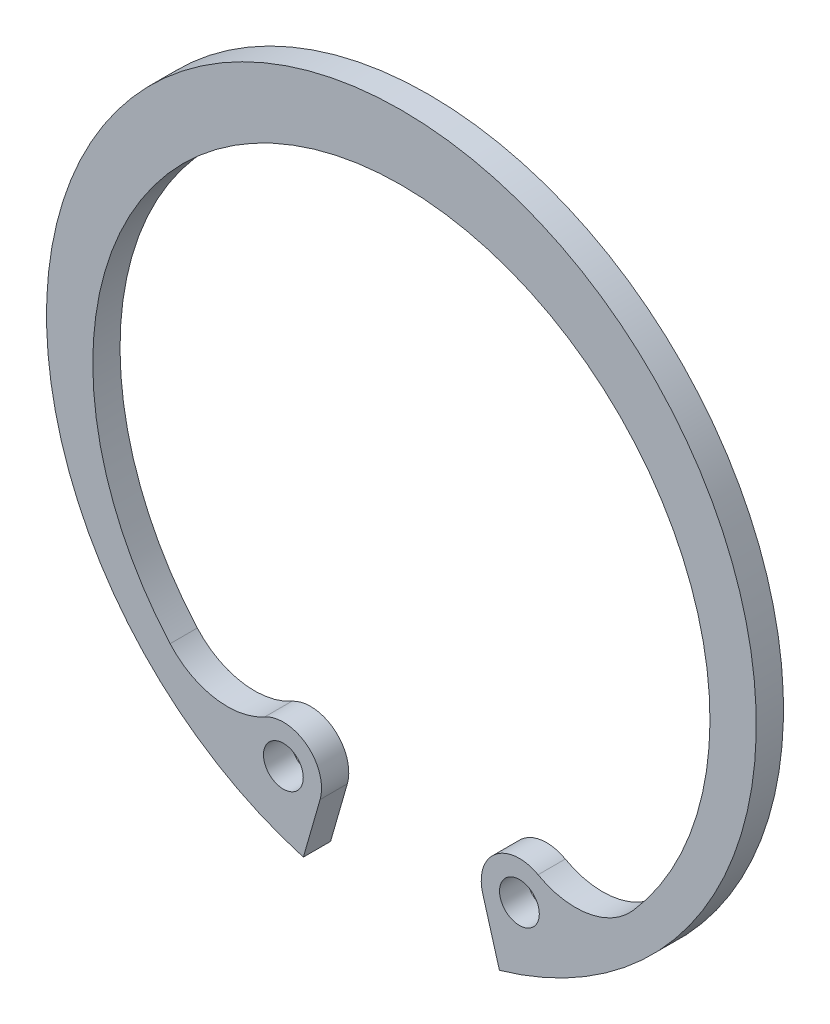
ISO-10303-21;
HEADER;
FILE_DESCRIPTION(('STEP AP214'),'2;1');
FILE_NAME('part.step','',(''),(''),'','','');
FILE_SCHEMA(('AUTOMOTIVE_DESIGN { 1 0 10303 214 1 1 1 1 }'));
ENDSEC;
DATA;
#1=APPLICATION_CONTEXT('core data for automotive mechanical design processes');
#2=APPLICATION_PROTOCOL_DEFINITION('international standard','automotive_design',2000,#1);
#3=PRODUCT_CONTEXT('',#1,'mechanical');
#4=PRODUCT('Part','Part','',(#3));
#5=PRODUCT_RELATED_PRODUCT_CATEGORY('part','',(#4));
#6=PRODUCT_DEFINITION_FORMATION('','',#4);
#7=PRODUCT_DEFINITION_CONTEXT('part definition',#1,'design');
#8=PRODUCT_DEFINITION('design','',#6,#7);
#9=PRODUCT_DEFINITION_SHAPE('','',#8);
#10=(LENGTH_UNIT() NAMED_UNIT(*) SI_UNIT(.MILLI.,.METRE.));
#11=(NAMED_UNIT(*) PLANE_ANGLE_UNIT() SI_UNIT($,.RADIAN.));
#12=(NAMED_UNIT(*) SI_UNIT($,.STERADIAN.) SOLID_ANGLE_UNIT());
#13=UNCERTAINTY_MEASURE_WITH_UNIT(LENGTH_MEASURE(1.E-05),#10,'distance_accuracy_value','');
#14=(GEOMETRIC_REPRESENTATION_CONTEXT(3) GLOBAL_UNCERTAINTY_ASSIGNED_CONTEXT((#13)) GLOBAL_UNIT_ASSIGNED_CONTEXT((#10,
#11,#12)) REPRESENTATION_CONTEXT('',''));
#15=CARTESIAN_POINT('',(0.,0.,0.));
#16=DIRECTION('',(0.,0.,1.));
#17=DIRECTION('',(1.,0.,0.));
#18=AXIS2_PLACEMENT_3D('',#15,#16,#17);
#19=CARTESIAN_POINT('',(0.,0.,-1.3));
#20=DIRECTION('',(0.,0.,1.));
#21=DIRECTION('',(1.,0.,0.));
#22=AXIS2_PLACEMENT_3D('',#19,#20,#21);
#23=CYLINDRICAL_SURFACE('',#22,16.95);
#24=CARTESIAN_POINT('',(0.,0.,0.));
#25=DIRECTION('',(0.,0.,1.));
#26=DIRECTION('',(1.,0.,0.));
#27=AXIS2_PLACEMENT_3D('',#24,#25,#26);
#28=CIRCLE('',#27,16.95);
#29=CARTESIAN_POINT('',(4.68211859774579,-16.2904961691363,0.));
#30=VERTEX_POINT('',#29);
#31=CARTESIAN_POINT('',(-4.68211859774579,-16.2904961691363,0.));
#32=VERTEX_POINT('',#31);
#33=EDGE_CURVE('E100',#30,#32,#28,.T.);
#34=ORIENTED_EDGE('',*,*,#33,.F.);
#35=DIRECTION('',(0.,0.,1.));
#36=VECTOR('',#35,1.);
#37=CARTESIAN_POINT('',(4.68211859774579,-16.2904961691363,-1.3));
#38=LINE('',#37,#36);
#39=CARTESIAN_POINT('',(4.68211859774579,-16.2904961691363,-1.3));
#40=VERTEX_POINT('',#39);
#41=EDGE_CURVE('E11',#40,#30,#38,.T.);
#42=ORIENTED_EDGE('',*,*,#41,.F.);
#43=CARTESIAN_POINT('',(0.,0.,-1.3));
#44=DIRECTION('',(0.,0.,1.));
#45=DIRECTION('',(1.,0.,0.));
#46=AXIS2_PLACEMENT_3D('',#43,#44,#45);
#47=CIRCLE('',#46,16.95);
#48=CARTESIAN_POINT('',(-4.68211859774579,-16.2904961691363,-1.3));
#49=VERTEX_POINT('',#48);
#50=EDGE_CURVE('E102',#40,#49,#47,.T.);
#51=ORIENTED_EDGE('',*,*,#50,.T.);
#52=DIRECTION('',(0.,0.,1.));
#53=VECTOR('',#52,1.);
#54=CARTESIAN_POINT('',(-4.68211859774579,-16.2904961691363,-1.3));
#55=LINE('',#54,#53);
#56=EDGE_CURVE('E39',#49,#32,#55,.T.);
#57=ORIENTED_EDGE('',*,*,#56,.T.);
#58=EDGE_LOOP('',(#34,#42,#51,#57));
#59=FACE_BOUND('',#58,.T.);
#60=ADVANCED_FACE('F36',(#59),#23,.T.);
#61=CARTESIAN_POINT('',(4.68211859774579,-16.2904961691363,-1.3));
#62=DIRECTION('',(-0.961091219418068,-0.276231185707716,0.));
#63=DIRECTION('',(0.276231185707716,-0.961091219418068,0.));
#64=AXIS2_PLACEMENT_3D('',#61,#62,#63);
#65=PLANE('',#64);
#66=DIRECTION('',(0.276231185707716,-0.961091219418068,0.));
#67=VECTOR('',#66,1.);
#68=CARTESIAN_POINT('',(4.68211859774579,-16.2904961691363,0.));
#69=LINE('',#68,#67);
#70=CARTESIAN_POINT('',(3.88298915635882,-13.5100849446478,0.));
#71=VERTEX_POINT('',#70);
#72=EDGE_CURVE('E118',#71,#30,#69,.T.);
#73=ORIENTED_EDGE('',*,*,#72,.F.);
#74=DIRECTION('',(0.,0.,1.));
#75=VECTOR('',#74,1.);
#76=CARTESIAN_POINT('',(3.88298915635882,-13.5100849446478,-1.3));
#77=LINE('',#76,#75);
#78=CARTESIAN_POINT('',(3.88298915635882,-13.5100849446478,-1.3));
#79=VERTEX_POINT('',#78);
#80=EDGE_CURVE('E44',#79,#71,#77,.T.);
#81=ORIENTED_EDGE('',*,*,#80,.F.);
#82=DIRECTION('',(0.276231185707716,-0.961091219418068,0.));
#83=VECTOR('',#82,1.);
#84=CARTESIAN_POINT('',(4.68211859774579,-16.2904961691363,-1.3));
#85=LINE('',#84,#83);
#86=EDGE_CURVE('E107',#79,#40,#85,.T.);
#87=ORIENTED_EDGE('',*,*,#86,.T.);
#88=ORIENTED_EDGE('',*,*,#41,.T.);
#89=EDGE_LOOP('',(#73,#81,#87,#88));
#90=FACE_BOUND('',#89,.T.);
#91=ADVANCED_FACE('F184',(#90),#65,.T.);
#92=CARTESIAN_POINT('',(5.6369806317968,-13.0059630307312,-1.3));
#93=DIRECTION('',(0.,0.,1.));
#94=DIRECTION('',(1.,0.,0.));
#95=AXIS2_PLACEMENT_3D('',#92,#93,#94);
#96=CYLINDRICAL_SURFACE('',#95,1.825);
#97=CARTESIAN_POINT('',(5.6369806317968,-13.0059630307312,0.));
#98=DIRECTION('',(0.,0.,1.));
#99=DIRECTION('',(1.,0.,0.));
#100=AXIS2_PLACEMENT_3D('',#97,#98,#99);
#101=CIRCLE('',#100,1.825);
#102=CARTESIAN_POINT('',(6.52840569211607,-11.4134849737914,0.));
#103=VERTEX_POINT('',#102);
#104=EDGE_CURVE('E136',#103,#71,#101,.T.);
#105=ORIENTED_EDGE('',*,*,#104,.F.);
#106=DIRECTION('',(0.,0.,1.));
#107=VECTOR('',#106,1.);
#108=CARTESIAN_POINT('',(6.52840569211607,-11.4134849737914,-1.3));
#109=LINE('',#108,#107);
#110=CARTESIAN_POINT('',(6.52840569211607,-11.4134849737914,-1.3));
#111=VERTEX_POINT('',#110);
#112=EDGE_CURVE('E158',#111,#103,#109,.T.);
#113=ORIENTED_EDGE('',*,*,#112,.F.);
#114=CARTESIAN_POINT('',(5.6369806317968,-13.0059630307312,-1.3));
#115=DIRECTION('',(0.,0.,1.));
#116=DIRECTION('',(1.,0.,0.));
#117=AXIS2_PLACEMENT_3D('',#114,#115,#116);
#118=CIRCLE('',#117,1.825);
#119=EDGE_CURVE('E154',#111,#79,#118,.T.);
#120=ORIENTED_EDGE('',*,*,#119,.T.);
#121=ORIENTED_EDGE('',*,*,#80,.T.);
#122=EDGE_LOOP('',(#105,#113,#120,#121));
#123=FACE_BOUND('',#122,.T.);
#124=ADVANCED_FACE('F183',(#123),#96,.T.);
#125=CARTESIAN_POINT('',(8.31125581275463,-8.22852885991183,-1.3));
#126=DIRECTION('',(0.,0.,1.));
#127=DIRECTION('',(1.,0.,0.));
#128=AXIS2_PLACEMENT_3D('',#125,#126,#127);
#129=CYLINDRICAL_SURFACE('',#128,3.65);
#130=CARTESIAN_POINT('',(8.31125581275463,-8.22852885991183,0.));
#131=DIRECTION('',(0.,0.,-1.));
#132=DIRECTION('',(1.,0.,0.));
#133=AXIS2_PLACEMENT_3D('',#130,#131,#132);
#134=CIRCLE('',#133,3.65);
#135=CARTESIAN_POINT('',(11.0470830170426,-10.6446723797132,0.));
#136=VERTEX_POINT('',#135);
#137=EDGE_CURVE('E133',#136,#103,#134,.T.);
#138=ORIENTED_EDGE('',*,*,#137,.F.);
#139=DIRECTION('',(0.,0.,1.));
#140=VECTOR('',#139,1.);
#141=CARTESIAN_POINT('',(11.0470830170426,-10.6446723797132,-1.3));
#142=LINE('',#141,#140);
#143=CARTESIAN_POINT('',(11.0470830170426,-10.6446723797132,-1.3));
#144=VERTEX_POINT('',#143);
#145=EDGE_CURVE('E160',#144,#136,#142,.T.);
#146=ORIENTED_EDGE('',*,*,#145,.F.);
#147=CARTESIAN_POINT('',(8.31125581275463,-8.22852885991183,-1.3));
#148=DIRECTION('',(0.,0.,-1.));
#149=DIRECTION('',(1.,0.,0.));
#150=AXIS2_PLACEMENT_3D('',#147,#148,#149);
#151=CIRCLE('',#150,3.65);
#152=EDGE_CURVE('E151',#144,#111,#151,.T.);
#153=ORIENTED_EDGE('',*,*,#152,.T.);
#154=ORIENTED_EDGE('',*,*,#112,.T.);
#155=EDGE_LOOP('',(#138,#146,#153,#154));
#156=FACE_BOUND('',#155,.T.);
#157=ADVANCED_FACE('F179',(#156),#129,.F.);
#158=CARTESIAN_POINT('',(0.,-0.888450202193895,-1.3));
#159=DIRECTION('',(0.,0.,1.));
#160=DIRECTION('',(1.,0.,0.));
#161=AXIS2_PLACEMENT_3D('',#158,#159,#160);
#162=CYLINDRICAL_SURFACE('',#161,14.7384502021939);
#163=CARTESIAN_POINT('',(0.,-0.888450202193895,0.));
#164=DIRECTION('',(0.,0.,-1.));
#165=DIRECTION('',(1.,0.,0.));
#166=AXIS2_PLACEMENT_3D('',#163,#164,#165);
#167=CIRCLE('',#166,14.7384502021939);
#168=CARTESIAN_POINT('',(-11.0470830170426,-10.6446723797132,0.));
#169=VERTEX_POINT('',#168);
#170=EDGE_CURVE('E130',#169,#136,#167,.T.);
#171=ORIENTED_EDGE('',*,*,#170,.F.);
#172=DIRECTION('',(0.,0.,1.));
#173=VECTOR('',#172,1.);
#174=CARTESIAN_POINT('',(-11.0470830170426,-10.6446723797132,-1.3));
#175=LINE('',#174,#173);
#176=CARTESIAN_POINT('',(-11.0470830170426,-10.6446723797132,-1.3));
#177=VERTEX_POINT('',#176);
#178=EDGE_CURVE('E162',#177,#169,#175,.T.);
#179=ORIENTED_EDGE('',*,*,#178,.F.);
#180=CARTESIAN_POINT('',(0.,-0.888450202193895,-1.3));
#181=DIRECTION('',(0.,0.,-1.));
#182=DIRECTION('',(1.,0.,0.));
#183=AXIS2_PLACEMENT_3D('',#180,#181,#182);
#184=CIRCLE('',#183,14.7384502021939);
#185=EDGE_CURVE('E148',#177,#144,#184,.T.);
#186=ORIENTED_EDGE('',*,*,#185,.T.);
#187=ORIENTED_EDGE('',*,*,#145,.T.);
#188=EDGE_LOOP('',(#171,#179,#186,#187));
#189=FACE_BOUND('',#188,.T.);
#190=ADVANCED_FACE('F175',(#189),#162,.F.);
#191=CARTESIAN_POINT('',(-8.31125581275462,-8.22852885991183,-1.3));
#192=DIRECTION('',(0.,0.,1.));
#193=DIRECTION('',(1.,0.,0.));
#194=AXIS2_PLACEMENT_3D('',#191,#192,#193);
#195=CYLINDRICAL_SURFACE('',#194,3.65);
#196=CARTESIAN_POINT('',(-8.31125581275462,-8.22852885991183,0.));
#197=DIRECTION('',(0.,0.,-1.));
#198=DIRECTION('',(1.,0.,0.));
#199=AXIS2_PLACEMENT_3D('',#196,#197,#198);
#200=CIRCLE('',#199,3.65);
#201=CARTESIAN_POINT('',(-6.52840569211607,-11.4134849737914,0.));
#202=VERTEX_POINT('',#201);
#203=EDGE_CURVE('E127',#202,#169,#200,.T.);
#204=ORIENTED_EDGE('',*,*,#203,.F.);
#205=DIRECTION('',(0.,0.,1.));
#206=VECTOR('',#205,1.);
#207=CARTESIAN_POINT('',(-6.52840569211607,-11.4134849737914,-1.3));
#208=LINE('',#207,#206);
#209=CARTESIAN_POINT('',(-6.52840569211607,-11.4134849737914,-1.3));
#210=VERTEX_POINT('',#209);
#211=EDGE_CURVE('E164',#210,#202,#208,.T.);
#212=ORIENTED_EDGE('',*,*,#211,.F.);
#213=CARTESIAN_POINT('',(-8.31125581275462,-8.22852885991183,-1.3));
#214=DIRECTION('',(0.,0.,-1.));
#215=DIRECTION('',(1.,0.,0.));
#216=AXIS2_PLACEMENT_3D('',#213,#214,#215);
#217=CIRCLE('',#216,3.65);
#218=EDGE_CURVE('E145',#210,#177,#217,.T.);
#219=ORIENTED_EDGE('',*,*,#218,.T.);
#220=ORIENTED_EDGE('',*,*,#178,.T.);
#221=EDGE_LOOP('',(#204,#212,#219,#220));
#222=FACE_BOUND('',#221,.T.);
#223=ADVANCED_FACE('F171',(#222),#195,.F.);
#224=CARTESIAN_POINT('',(-5.6369806317968,-13.0059630307312,-1.3));
#225=DIRECTION('',(0.,0.,1.));
#226=DIRECTION('',(1.,0.,0.));
#227=AXIS2_PLACEMENT_3D('',#224,#225,#226);
#228=CYLINDRICAL_SURFACE('',#227,1.825);
#229=CARTESIAN_POINT('',(-5.6369806317968,-13.0059630307312,0.));
#230=DIRECTION('',(0.,0.,1.));
#231=DIRECTION('',(1.,0.,0.));
#232=AXIS2_PLACEMENT_3D('',#229,#230,#231);
#233=CIRCLE('',#232,1.825);
#234=CARTESIAN_POINT('',(-3.88298915635882,-13.5100849446478,0.));
#235=VERTEX_POINT('',#234);
#236=EDGE_CURVE('E114',#235,#202,#233,.T.);
#237=ORIENTED_EDGE('',*,*,#236,.F.);
#238=DIRECTION('',(0.,0.,1.));
#239=VECTOR('',#238,1.);
#240=CARTESIAN_POINT('',(-3.88298915635882,-13.5100849446478,-1.3));
#241=LINE('',#240,#239);
#242=CARTESIAN_POINT('',(-3.88298915635882,-13.5100849446478,-1.3));
#243=VERTEX_POINT('',#242);
#244=EDGE_CURVE('E106',#243,#235,#241,.T.);
#245=ORIENTED_EDGE('',*,*,#244,.F.);
#246=CARTESIAN_POINT('',(-5.6369806317968,-13.0059630307312,-1.3));
#247=DIRECTION('',(0.,0.,1.));
#248=DIRECTION('',(1.,0.,0.));
#249=AXIS2_PLACEMENT_3D('',#246,#247,#248);
#250=CIRCLE('',#249,1.825);
#251=EDGE_CURVE('E142',#243,#210,#250,.T.);
#252=ORIENTED_EDGE('',*,*,#251,.T.);
#253=ORIENTED_EDGE('',*,*,#211,.T.);
#254=EDGE_LOOP('',(#237,#245,#252,#253));
#255=FACE_BOUND('',#254,.T.);
#256=ADVANCED_FACE('F167',(#255),#228,.T.);
#257=CARTESIAN_POINT('',(-4.68211859774579,-16.2904961691363,-1.3));
#258=DIRECTION('',(0.961091219418068,-0.276231185707716,0.));
#259=DIRECTION('',(0.276231185707716,0.961091219418068,0.));
#260=AXIS2_PLACEMENT_3D('',#257,#258,#259);
#261=PLANE('',#260);
#262=DIRECTION('',(0.276231185707716,0.961091219418068,0.));
#263=VECTOR('',#262,1.);
#264=CARTESIAN_POINT('',(-4.68211859774579,-16.2904961691363,0.));
#265=LINE('',#264,#263);
#266=EDGE_CURVE('E109',#32,#235,#265,.T.);
#267=ORIENTED_EDGE('',*,*,#266,.F.);
#268=ORIENTED_EDGE('',*,*,#56,.F.);
#269=DIRECTION('',(0.276231185707716,0.961091219418068,0.));
#270=VECTOR('',#269,1.);
#271=CARTESIAN_POINT('',(-4.68211859774579,-16.2904961691363,-1.3));
#272=LINE('',#271,#270);
#273=EDGE_CURVE('E140',#49,#243,#272,.T.);
#274=ORIENTED_EDGE('',*,*,#273,.T.);
#275=ORIENTED_EDGE('',*,*,#244,.T.);
#276=EDGE_LOOP('',(#267,#268,#274,#275));
#277=FACE_BOUND('',#276,.T.);
#278=ADVANCED_FACE('F110',(#277),#261,.T.);
#279=CARTESIAN_POINT('',(0.,0.,-1.3));
#280=DIRECTION('',(0.,0.,1.));
#281=DIRECTION('',(1.,0.,0.));
#282=AXIS2_PLACEMENT_3D('',#279,#280,#281);
#283=PLANE('',#282);
#284=CARTESIAN_POINT('',(-5.6369806317968,-13.0059630307312,-1.3));
#285=DIRECTION('',(0.,0.,1.));
#286=DIRECTION('',(1.,0.,0.));
#287=AXIS2_PLACEMENT_3D('',#284,#285,#286);
#288=CIRCLE('',#287,0.95);
#289=CARTESIAN_POINT('',(-4.6869806317968,-13.0059630307312,-1.3));
#290=VERTEX_POINT('',#289);
#291=EDGE_CURVE('E260',#290,#290,#288,.T.);
#292=ORIENTED_EDGE('',*,*,#291,.T.);
#293=EDGE_LOOP('',(#292));
#294=FACE_BOUND('',#293,.T.);
#295=CARTESIAN_POINT('',(5.6369806317968,-13.0059630307312,-1.3));
#296=DIRECTION('',(0.,0.,1.));
#297=DIRECTION('',(1.,0.,0.));
#298=AXIS2_PLACEMENT_3D('',#295,#296,#297);
#299=CIRCLE('',#298,0.95);
#300=CARTESIAN_POINT('',(6.5869806317968,-13.0059630307312,-1.3));
#301=VERTEX_POINT('',#300);
#302=EDGE_CURVE('E119',#301,#301,#299,.T.);
#303=ORIENTED_EDGE('',*,*,#302,.T.);
#304=EDGE_LOOP('',(#303));
#305=FACE_BOUND('',#304,.T.);
#306=ORIENTED_EDGE('',*,*,#50,.F.);
#307=ORIENTED_EDGE('',*,*,#86,.F.);
#308=ORIENTED_EDGE('',*,*,#119,.F.);
#309=ORIENTED_EDGE('',*,*,#152,.F.);
#310=ORIENTED_EDGE('',*,*,#185,.F.);
#311=ORIENTED_EDGE('',*,*,#218,.F.);
#312=ORIENTED_EDGE('',*,*,#251,.F.);
#313=ORIENTED_EDGE('',*,*,#273,.F.);
#314=EDGE_LOOP('',(#306,#307,#308,#309,#310,#311,#312,#313));
#315=FACE_BOUND('',#314,.T.);
#316=ADVANCED_FACE('F187',(#294,#305,#315),#283,.F.);
#317=CARTESIAN_POINT('',(0.,0.,0.));
#318=DIRECTION('',(0.,0.,1.));
#319=DIRECTION('',(1.,0.,0.));
#320=AXIS2_PLACEMENT_3D('',#317,#318,#319);
#321=PLANE('',#320);
#322=CARTESIAN_POINT('',(-5.6369806317968,-13.0059630307312,0.));
#323=DIRECTION('',(0.,0.,1.));
#324=DIRECTION('',(1.,0.,0.));
#325=AXIS2_PLACEMENT_3D('',#322,#323,#324);
#326=CIRCLE('',#325,0.95);
#327=CARTESIAN_POINT('',(-4.6869806317968,-13.0059630307312,0.));
#328=VERTEX_POINT('',#327);
#329=EDGE_CURVE('E263',#328,#328,#326,.T.);
#330=ORIENTED_EDGE('',*,*,#329,.F.);
#331=EDGE_LOOP('',(#330));
#332=FACE_BOUND('',#331,.T.);
#333=CARTESIAN_POINT('',(5.6369806317968,-13.0059630307312,0.));
#334=DIRECTION('',(0.,0.,1.));
#335=DIRECTION('',(1.,0.,0.));
#336=AXIS2_PLACEMENT_3D('',#333,#334,#335);
#337=CIRCLE('',#336,0.95);
#338=CARTESIAN_POINT('',(6.5869806317968,-13.0059630307312,0.));
#339=VERTEX_POINT('',#338);
#340=EDGE_CURVE('E122',#339,#339,#337,.T.);
#341=ORIENTED_EDGE('',*,*,#340,.F.);
#342=EDGE_LOOP('',(#341));
#343=FACE_BOUND('',#342,.T.);
#344=ORIENTED_EDGE('',*,*,#33,.T.);
#345=ORIENTED_EDGE('',*,*,#266,.T.);
#346=ORIENTED_EDGE('',*,*,#236,.T.);
#347=ORIENTED_EDGE('',*,*,#203,.T.);
#348=ORIENTED_EDGE('',*,*,#170,.T.);
#349=ORIENTED_EDGE('',*,*,#137,.T.);
#350=ORIENTED_EDGE('',*,*,#104,.T.);
#351=ORIENTED_EDGE('',*,*,#72,.T.);
#352=EDGE_LOOP('',(#344,#345,#346,#347,#348,#349,#350,#351));
#353=FACE_BOUND('',#352,.T.);
#354=ADVANCED_FACE('F116',(#332,#343,#353),#321,.T.);
#355=CARTESIAN_POINT('',(5.6369806317968,-13.0059630307312,-1.3));
#356=DIRECTION('',(0.,0.,1.));
#357=DIRECTION('',(1.,0.,0.));
#358=AXIS2_PLACEMENT_3D('',#355,#356,#357);
#359=CYLINDRICAL_SURFACE('',#358,0.95);
#360=ORIENTED_EDGE('',*,*,#302,.F.);
#361=EDGE_LOOP('',(#360));
#362=FACE_BOUND('',#361,.T.);
#363=ORIENTED_EDGE('',*,*,#340,.T.);
#364=EDGE_LOOP('',(#363));
#365=FACE_BOUND('',#364,.T.);
#366=ADVANCED_FACE('F195',(#362,#365),#359,.F.);
#367=CARTESIAN_POINT('',(-5.6369806317968,-13.0059630307312,-1.3));
#368=DIRECTION('',(0.,0.,1.));
#369=DIRECTION('',(1.,0.,0.));
#370=AXIS2_PLACEMENT_3D('',#367,#368,#369);
#371=CYLINDRICAL_SURFACE('',#370,0.95);
#372=ORIENTED_EDGE('',*,*,#291,.F.);
#373=EDGE_LOOP('',(#372));
#374=FACE_BOUND('',#373,.T.);
#375=ORIENTED_EDGE('',*,*,#329,.T.);
#376=EDGE_LOOP('',(#375));
#377=FACE_BOUND('',#376,.T.);
#378=ADVANCED_FACE('F244',(#374,#377),#371,.F.);
#379=CLOSED_SHELL('',(#60,#91,#124,#157,#190,#223,#256,#278,#316,#354,#366,#378));
#380=MANIFOLD_SOLID_BREP('B2',#379);
#381=ADVANCED_BREP_SHAPE_REPRESENTATION('',(#18,#380),#14);
#382=SHAPE_DEFINITION_REPRESENTATION(#9,#381);
ENDSEC;
END-ISO-10303-21;
